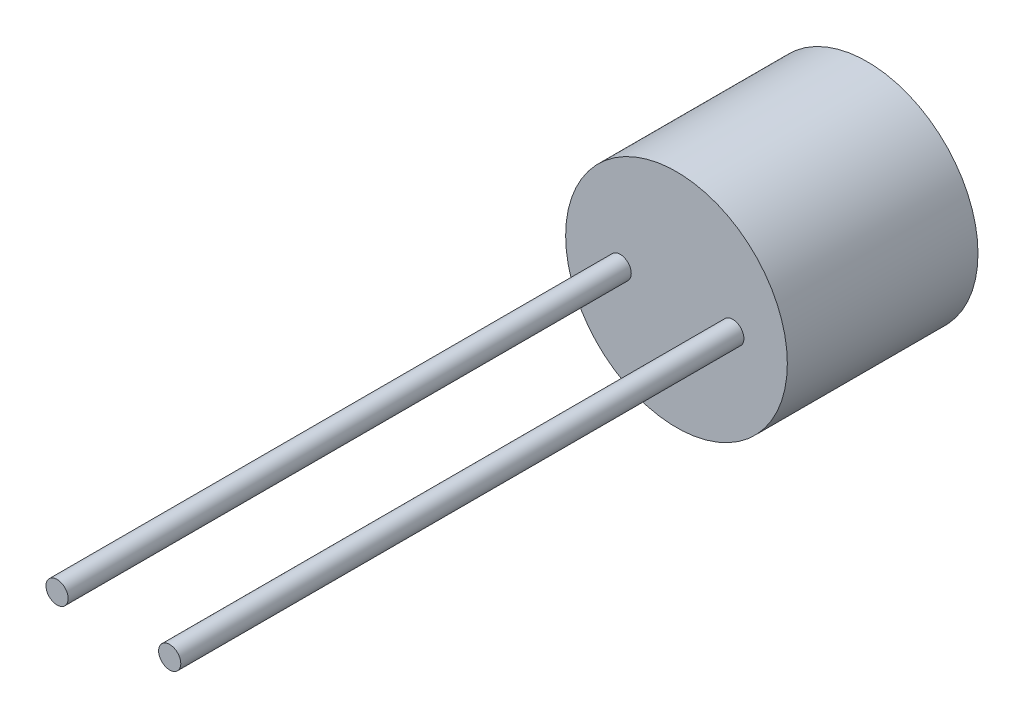
ISO-10303-21;
HEADER;
FILE_DESCRIPTION(('STEP AP214'),'2;1');
FILE_NAME('part.step','',(''),(''),'','','');
FILE_SCHEMA(('AUTOMOTIVE_DESIGN { 1 0 10303 214 1 1 1 1 }'));
ENDSEC;
DATA;
#1=APPLICATION_CONTEXT('core data for automotive mechanical design processes');
#2=APPLICATION_PROTOCOL_DEFINITION('international standard','automotive_design',2000,#1);
#3=PRODUCT_CONTEXT('',#1,'mechanical');
#4=PRODUCT('Part','Part','',(#3));
#5=PRODUCT_RELATED_PRODUCT_CATEGORY('part','',(#4));
#6=PRODUCT_DEFINITION_FORMATION('','',#4);
#7=PRODUCT_DEFINITION_CONTEXT('part definition',#1,'design');
#8=PRODUCT_DEFINITION('design','',#6,#7);
#9=PRODUCT_DEFINITION_SHAPE('','',#8);
#10=(LENGTH_UNIT() NAMED_UNIT(*) SI_UNIT(.MILLI.,.METRE.));
#11=(NAMED_UNIT(*) PLANE_ANGLE_UNIT() SI_UNIT($,.RADIAN.));
#12=(NAMED_UNIT(*) SI_UNIT($,.STERADIAN.) SOLID_ANGLE_UNIT());
#13=UNCERTAINTY_MEASURE_WITH_UNIT(LENGTH_MEASURE(1.E-05),#10,'distance_accuracy_value','');
#14=(GEOMETRIC_REPRESENTATION_CONTEXT(3) GLOBAL_UNCERTAINTY_ASSIGNED_CONTEXT((#13)) GLOBAL_UNIT_ASSIGNED_CONTEXT((#10,
#11,#12)) REPRESENTATION_CONTEXT('',''));
#15=CARTESIAN_POINT('',(0.,0.,0.));
#16=DIRECTION('',(0.,0.,1.));
#17=DIRECTION('',(1.,0.,0.));
#18=AXIS2_PLACEMENT_3D('',#15,#16,#17);
#19=CARTESIAN_POINT('',(0.,0.,4.3));
#20=DIRECTION('',(0.,0.,1.));
#21=DIRECTION('',(1.,0.,0.));
#22=AXIS2_PLACEMENT_3D('',#19,#20,#21);
#23=PLANE('',#22);
#24=CARTESIAN_POINT('',(-1.27,0.,4.3));
#25=DIRECTION('',(0.,0.,1.));
#26=DIRECTION('',(1.,0.,0.));
#27=AXIS2_PLACEMENT_3D('',#24,#25,#26);
#28=CIRCLE('',#27,0.25);
#29=CARTESIAN_POINT('',(-1.02,0.,4.3));
#30=VERTEX_POINT('',#29);
#31=EDGE_CURVE('E51',#30,#30,#28,.T.);
#32=ORIENTED_EDGE('',*,*,#31,.F.);
#33=EDGE_LOOP('',(#32));
#34=FACE_BOUND('',#33,.T.);
#35=CARTESIAN_POINT('',(0.,0.,4.3));
#36=DIRECTION('',(0.,0.,1.));
#37=DIRECTION('',(1.,0.,0.));
#38=AXIS2_PLACEMENT_3D('',#35,#36,#37);
#39=CIRCLE('',#38,2.5);
#40=CARTESIAN_POINT('',(2.5,0.,4.3));
#41=VERTEX_POINT('',#40);
#42=EDGE_CURVE('E43',#41,#41,#39,.T.);
#43=ORIENTED_EDGE('',*,*,#42,.T.);
#44=EDGE_LOOP('',(#43));
#45=FACE_BOUND('',#44,.T.);
#46=CARTESIAN_POINT('',(1.27,0.,4.3));
#47=DIRECTION('',(0.,0.,1.));
#48=DIRECTION('',(-1.,0.,0.));
#49=AXIS2_PLACEMENT_3D('',#46,#47,#48);
#50=CIRCLE('',#49,0.25);
#51=CARTESIAN_POINT('',(1.02,0.,4.3));
#52=VERTEX_POINT('',#51);
#53=EDGE_CURVE('E59',#52,#52,#50,.T.);
#54=ORIENTED_EDGE('',*,*,#53,.F.);
#55=EDGE_LOOP('',(#54));
#56=FACE_BOUND('',#55,.T.);
#57=ADVANCED_FACE('F36',(#34,#45,#56),#23,.T.);
#58=CARTESIAN_POINT('',(0.,0.,3.3));
#59=DIRECTION('',(0.,0.,-1.));
#60=DIRECTION('',(-1.,0.,0.));
#61=AXIS2_PLACEMENT_3D('',#58,#59,#60);
#62=CYLINDRICAL_SURFACE('',#61,2.5);
#63=CARTESIAN_POINT('',(0.,0.,0.));
#64=DIRECTION('',(0.,0.,1.));
#65=DIRECTION('',(1.,0.,0.));
#66=AXIS2_PLACEMENT_3D('',#63,#64,#65);
#67=CIRCLE('',#66,2.5);
#68=CARTESIAN_POINT('',(2.5,0.,0.));
#69=VERTEX_POINT('',#68);
#70=EDGE_CURVE('E10',#69,#69,#67,.T.);
#71=ORIENTED_EDGE('',*,*,#70,.T.);
#72=EDGE_LOOP('',(#71));
#73=FACE_BOUND('',#72,.T.);
#74=ORIENTED_EDGE('',*,*,#42,.F.);
#75=EDGE_LOOP('',(#74));
#76=FACE_BOUND('',#75,.T.);
#77=ADVANCED_FACE('F38',(#73,#76),#62,.T.);
#78=CARTESIAN_POINT('',(0.,0.,0.));
#79=DIRECTION('',(0.,0.,1.));
#80=DIRECTION('',(1.,0.,0.));
#81=AXIS2_PLACEMENT_3D('',#78,#79,#80);
#82=PLANE('',#81);
#83=ORIENTED_EDGE('',*,*,#70,.F.);
#84=EDGE_LOOP('',(#83));
#85=FACE_BOUND('',#84,.T.);
#86=ADVANCED_FACE('F71',(#85),#82,.F.);
#87=CARTESIAN_POINT('',(-1.27,0.,17.));
#88=DIRECTION('',(0.,0.,-1.));
#89=DIRECTION('',(-1.,0.,0.));
#90=AXIS2_PLACEMENT_3D('',#87,#88,#89);
#91=CYLINDRICAL_SURFACE('',#90,0.25);
#92=CARTESIAN_POINT('',(-1.27,0.,17.));
#93=DIRECTION('',(0.,0.,1.));
#94=DIRECTION('',(1.,0.,0.));
#95=AXIS2_PLACEMENT_3D('',#92,#93,#94);
#96=CIRCLE('',#95,0.25);
#97=CARTESIAN_POINT('',(-1.02,0.,17.));
#98=VERTEX_POINT('',#97);
#99=EDGE_CURVE('E47',#98,#98,#96,.T.);
#100=ORIENTED_EDGE('',*,*,#99,.F.);
#101=EDGE_LOOP('',(#100));
#102=FACE_BOUND('',#101,.T.);
#103=ORIENTED_EDGE('',*,*,#31,.T.);
#104=EDGE_LOOP('',(#103));
#105=FACE_BOUND('',#104,.T.);
#106=ADVANCED_FACE('F74',(#102,#105),#91,.T.);
#107=CARTESIAN_POINT('',(-1.27,0.,17.));
#108=DIRECTION('',(0.,0.,1.));
#109=DIRECTION('',(1.,0.,0.));
#110=AXIS2_PLACEMENT_3D('',#107,#108,#109);
#111=PLANE('',#110);
#112=ORIENTED_EDGE('',*,*,#99,.T.);
#113=EDGE_LOOP('',(#112));
#114=FACE_BOUND('',#113,.T.);
#115=ADVANCED_FACE('F81',(#114),#111,.T.);
#116=CARTESIAN_POINT('',(1.27,0.,17.));
#117=DIRECTION('',(0.,0.,-1.));
#118=DIRECTION('',(-1.,0.,0.));
#119=AXIS2_PLACEMENT_3D('',#116,#117,#118);
#120=CYLINDRICAL_SURFACE('',#119,0.25);
#121=CARTESIAN_POINT('',(1.27,0.,17.));
#122=DIRECTION('',(0.,0.,1.));
#123=DIRECTION('',(-1.,0.,0.));
#124=AXIS2_PLACEMENT_3D('',#121,#122,#123);
#125=CIRCLE('',#124,0.25);
#126=CARTESIAN_POINT('',(1.02,0.,17.));
#127=VERTEX_POINT('',#126);
#128=EDGE_CURVE('E56',#127,#127,#125,.T.);
#129=ORIENTED_EDGE('',*,*,#128,.F.);
#130=EDGE_LOOP('',(#129));
#131=FACE_BOUND('',#130,.T.);
#132=ORIENTED_EDGE('',*,*,#53,.T.);
#133=EDGE_LOOP('',(#132));
#134=FACE_BOUND('',#133,.T.);
#135=ADVANCED_FACE('F63',(#131,#134),#120,.T.);
#136=CARTESIAN_POINT('',(1.27,0.,17.));
#137=DIRECTION('',(0.,0.,-1.));
#138=DIRECTION('',(-1.,0.,0.));
#139=AXIS2_PLACEMENT_3D('',#136,#137,#138);
#140=PLANE('',#139);
#141=ORIENTED_EDGE('',*,*,#128,.T.);
#142=EDGE_LOOP('',(#141));
#143=FACE_BOUND('',#142,.T.);
#144=ADVANCED_FACE('F92',(#143),#140,.F.);
#145=CLOSED_SHELL('',(#57,#77,#86,#106,#115,#135,#144));
#146=MANIFOLD_SOLID_BREP('B2',#145);
#147=ADVANCED_BREP_SHAPE_REPRESENTATION('',(#18,#146),#14);
#148=SHAPE_DEFINITION_REPRESENTATION(#9,#147);
ENDSEC;
END-ISO-10303-21;
